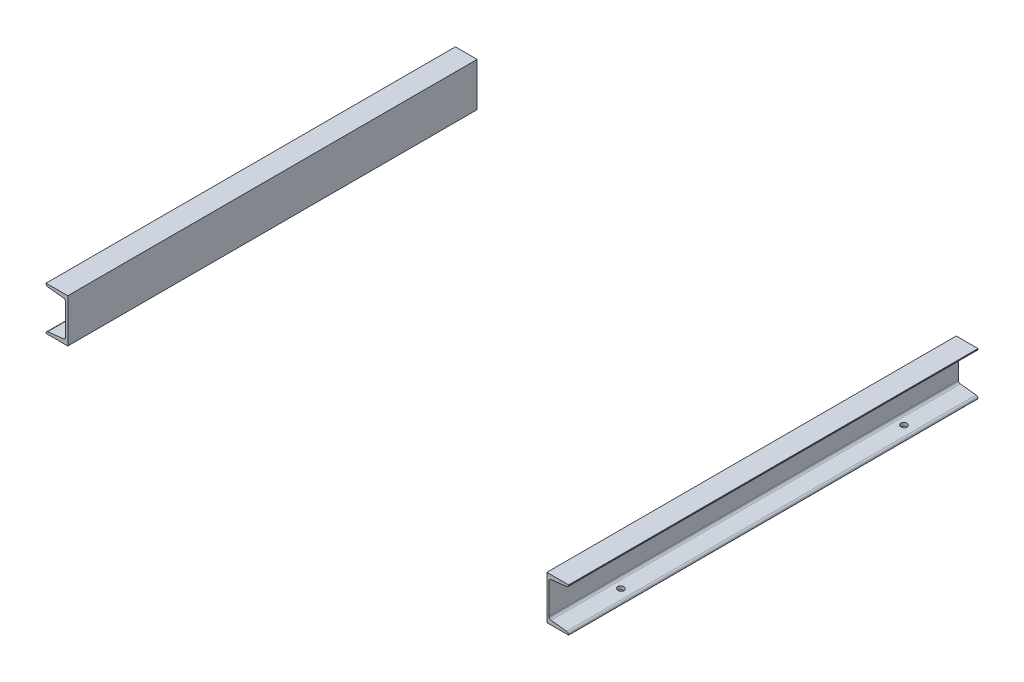
ISO-10303-21;
HEADER;
FILE_DESCRIPTION(('STEP AP214'),'2;1');
FILE_NAME('part.step','',(''),(''),'','','');
FILE_SCHEMA(('AUTOMOTIVE_DESIGN { 1 0 10303 214 1 1 1 1 }'));
ENDSEC;
DATA;
#1=APPLICATION_CONTEXT('core data for automotive mechanical design processes');
#2=APPLICATION_PROTOCOL_DEFINITION('international standard','automotive_design',2000,#1);
#3=PRODUCT_CONTEXT('',#1,'mechanical');
#4=PRODUCT('Part','Part','',(#3));
#5=PRODUCT_RELATED_PRODUCT_CATEGORY('part','',(#4));
#6=PRODUCT_DEFINITION_FORMATION('','',#4);
#7=PRODUCT_DEFINITION_CONTEXT('part definition',#1,'design');
#8=PRODUCT_DEFINITION('design','',#6,#7);
#9=PRODUCT_DEFINITION_SHAPE('','',#8);
#10=(LENGTH_UNIT() NAMED_UNIT(*) SI_UNIT(.MILLI.,.METRE.));
#11=(NAMED_UNIT(*) PLANE_ANGLE_UNIT() SI_UNIT($,.RADIAN.));
#12=(NAMED_UNIT(*) SI_UNIT($,.STERADIAN.) SOLID_ANGLE_UNIT());
#13=UNCERTAINTY_MEASURE_WITH_UNIT(LENGTH_MEASURE(1.E-05),#10,'distance_accuracy_value','');
#14=(GEOMETRIC_REPRESENTATION_CONTEXT(3) GLOBAL_UNCERTAINTY_ASSIGNED_CONTEXT((#13)) GLOBAL_UNIT_ASSIGNED_CONTEXT((#10,
#11,#12)) REPRESENTATION_CONTEXT('',''));
#15=CARTESIAN_POINT('',(0.,0.,0.));
#16=DIRECTION('',(0.,0.,1.));
#17=DIRECTION('',(1.,0.,0.));
#18=AXIS2_PLACEMENT_3D('',#15,#16,#17);
#19=CARTESIAN_POINT('',(600.,0.,470.000000000004));
#20=DIRECTION('',(-1.,0.,0.));
#21=DIRECTION('',(0.,0.,1.));
#22=AXIS2_PLACEMENT_3D('',#19,#20,#21);
#23=PLANE('',#22);
#24=DIRECTION('',(0.,1.,0.));
#25=VECTOR('',#24,1.);
#26=CARTESIAN_POINT('',(600.,0.,-469.999999999996));
#27=LINE('',#26,#25);
#28=CARTESIAN_POINT('',(600.,-0.52478603436791,-469.999999999996));
#29=VERTEX_POINT('',#28);
#30=CARTESIAN_POINT('',(600.,0.,-469.999999999996));
#31=VERTEX_POINT('',#30);
#32=EDGE_CURVE('E164',#29,#31,#27,.T.);
#33=ORIENTED_EDGE('',*,*,#32,.T.);
#34=DIRECTION('',(0.,0.,-1.));
#35=VECTOR('',#34,1.);
#36=CARTESIAN_POINT('',(600.,0.,470.000000000004));
#37=LINE('',#36,#35);
#38=CARTESIAN_POINT('',(600.,0.,470.000000000004));
#39=VERTEX_POINT('',#38);
#40=EDGE_CURVE('E12',#39,#31,#37,.T.);
#41=ORIENTED_EDGE('',*,*,#40,.F.);
#42=DIRECTION('',(0.,1.,0.));
#43=VECTOR('',#42,1.);
#44=CARTESIAN_POINT('',(600.,0.,470.000000000004));
#45=LINE('',#44,#43);
#46=CARTESIAN_POINT('',(600.,-0.52478603436791,470.000000000004));
#47=VERTEX_POINT('',#46);
#48=EDGE_CURVE('E186',#47,#39,#45,.T.);
#49=ORIENTED_EDGE('',*,*,#48,.F.);
#50=DIRECTION('',(0.,0.,-1.));
#51=VECTOR('',#50,1.);
#52=CARTESIAN_POINT('',(600.,-0.52478603436791,470.000000000004));
#53=LINE('',#52,#51);
#54=EDGE_CURVE('E160',#47,#29,#53,.T.);
#55=ORIENTED_EDGE('',*,*,#54,.T.);
#56=EDGE_LOOP('',(#33,#41,#49,#55));
#57=FACE_BOUND('',#56,.T.);
#58=ADVANCED_FACE('F42',(#57),#23,.F.);
#59=CARTESIAN_POINT('',(600.,0.,470.000000000004));
#60=DIRECTION('',(0.,-1.,0.));
#61=DIRECTION('',(0.,0.,-1.));
#62=AXIS2_PLACEMENT_3D('',#59,#60,#61);
#63=PLANE('',#62);
#64=DIRECTION('',(-1.,0.,0.));
#65=VECTOR('',#64,1.);
#66=CARTESIAN_POINT('',(600.,0.,-469.999999999996));
#67=LINE('',#66,#65);
#68=CARTESIAN_POINT('',(550.,0.,-469.999999999996));
#69=VERTEX_POINT('',#68);
#70=EDGE_CURVE('E167',#31,#69,#67,.T.);
#71=ORIENTED_EDGE('',*,*,#70,.T.);
#72=DIRECTION('',(0.,0.,-1.));
#73=VECTOR('',#72,1.);
#74=CARTESIAN_POINT('',(550.,0.,470.000000000004));
#75=LINE('',#74,#73);
#76=CARTESIAN_POINT('',(550.,0.,470.000000000004));
#77=VERTEX_POINT('',#76);
#78=EDGE_CURVE('E51',#77,#69,#75,.T.);
#79=ORIENTED_EDGE('',*,*,#78,.F.);
#80=DIRECTION('',(-1.,0.,0.));
#81=VECTOR('',#80,1.);
#82=CARTESIAN_POINT('',(600.,0.,470.000000000004));
#83=LINE('',#82,#81);
#84=EDGE_CURVE('E115',#39,#77,#83,.T.);
#85=ORIENTED_EDGE('',*,*,#84,.F.);
#86=ORIENTED_EDGE('',*,*,#40,.T.);
#87=EDGE_LOOP('',(#71,#79,#85,#86));
#88=FACE_BOUND('',#87,.T.);
#89=ADVANCED_FACE('F264',(#88),#63,.F.);
#90=CARTESIAN_POINT('',(550.,0.,470.000000000004));
#91=DIRECTION('',(1.,0.,0.));
#92=DIRECTION('',(0.,0.,-1.));
#93=AXIS2_PLACEMENT_3D('',#90,#91,#92);
#94=PLANE('',#93);
#95=DIRECTION('',(0.,-1.,0.));
#96=VECTOR('',#95,1.);
#97=CARTESIAN_POINT('',(550.,0.,-469.999999999996));
#98=LINE('',#97,#96);
#99=CARTESIAN_POINT('',(550.,-100.,-469.999999999996));
#100=VERTEX_POINT('',#99);
#101=EDGE_CURVE('E169',#69,#100,#98,.T.);
#102=ORIENTED_EDGE('',*,*,#101,.T.);
#103=DIRECTION('',(0.,0.,-1.));
#104=VECTOR('',#103,1.);
#105=CARTESIAN_POINT('',(550.,-100.,470.000000000004));
#106=LINE('',#105,#104);
#107=CARTESIAN_POINT('',(550.,-100.,470.000000000004));
#108=VERTEX_POINT('',#107);
#109=EDGE_CURVE('E205',#108,#100,#106,.T.);
#110=ORIENTED_EDGE('',*,*,#109,.F.);
#111=DIRECTION('',(0.,-1.,0.));
#112=VECTOR('',#111,1.);
#113=CARTESIAN_POINT('',(550.,0.,470.000000000004));
#114=LINE('',#113,#112);
#115=EDGE_CURVE('E225',#77,#108,#114,.T.);
#116=ORIENTED_EDGE('',*,*,#115,.F.);
#117=ORIENTED_EDGE('',*,*,#78,.T.);
#118=EDGE_LOOP('',(#102,#110,#116,#117));
#119=FACE_BOUND('',#118,.T.);
#120=ADVANCED_FACE('F268',(#119),#94,.F.);
#121=CARTESIAN_POINT('',(550.,-100.,470.000000000004));
#122=DIRECTION('',(0.,1.,0.));
#123=DIRECTION('',(0.,0.,1.));
#124=AXIS2_PLACEMENT_3D('',#121,#122,#123);
#125=PLANE('',#124);
#126=CARTESIAN_POINT('',(575.,-100.,-325.));
#127=DIRECTION('',(0.,-1.,0.));
#128=DIRECTION('',(0.,0.,-1.));
#129=AXIS2_PLACEMENT_3D('',#126,#127,#128);
#130=CIRCLE('',#129,7.00000000000004);
#131=CARTESIAN_POINT('',(575.,-100.,-332.));
#132=VERTEX_POINT('',#131);
#133=EDGE_CURVE('E211',#132,#132,#130,.T.);
#134=ORIENTED_EDGE('',*,*,#133,.F.);
#135=EDGE_LOOP('',(#134));
#136=FACE_BOUND('',#135,.T.);
#137=CARTESIAN_POINT('',(575.,-100.,325.));
#138=DIRECTION('',(0.,-1.,0.));
#139=DIRECTION('',(0.,0.,1.));
#140=AXIS2_PLACEMENT_3D('',#137,#138,#139);
#141=CIRCLE('',#140,7.00000000000004);
#142=CARTESIAN_POINT('',(575.,-100.,332.));
#143=VERTEX_POINT('',#142);
#144=EDGE_CURVE('E216',#143,#143,#141,.T.);
#145=ORIENTED_EDGE('',*,*,#144,.F.);
#146=EDGE_LOOP('',(#145));
#147=FACE_BOUND('',#146,.T.);
#148=DIRECTION('',(1.,0.,0.));
#149=VECTOR('',#148,1.);
#150=CARTESIAN_POINT('',(550.,-100.,-469.999999999996));
#151=LINE('',#150,#149);
#152=CARTESIAN_POINT('',(600.,-100.,-469.999999999996));
#153=VERTEX_POINT('',#152);
#154=EDGE_CURVE('E171',#100,#153,#151,.T.);
#155=ORIENTED_EDGE('',*,*,#154,.T.);
#156=DIRECTION('',(0.,0.,-1.));
#157=VECTOR('',#156,1.);
#158=CARTESIAN_POINT('',(600.,-100.,470.000000000004));
#159=LINE('',#158,#157);
#160=CARTESIAN_POINT('',(600.,-100.,470.000000000004));
#161=VERTEX_POINT('',#160);
#162=EDGE_CURVE('E202',#161,#153,#159,.T.);
#163=ORIENTED_EDGE('',*,*,#162,.F.);
#164=DIRECTION('',(1.,0.,0.));
#165=VECTOR('',#164,1.);
#166=CARTESIAN_POINT('',(550.,-100.,470.000000000004));
#167=LINE('',#166,#165);
#168=EDGE_CURVE('E227',#108,#161,#167,.T.);
#169=ORIENTED_EDGE('',*,*,#168,.F.);
#170=ORIENTED_EDGE('',*,*,#109,.T.);
#171=EDGE_LOOP('',(#155,#163,#169,#170));
#172=FACE_BOUND('',#171,.T.);
#173=ADVANCED_FACE('F272',(#136,#147,#172),#125,.F.);
#174=CARTESIAN_POINT('',(600.,-100.,470.000000000004));
#175=DIRECTION('',(-1.,0.,0.));
#176=DIRECTION('',(0.,0.,1.));
#177=AXIS2_PLACEMENT_3D('',#174,#175,#176);
#178=PLANE('',#177);
#179=DIRECTION('',(0.,1.,0.));
#180=VECTOR('',#179,1.);
#181=CARTESIAN_POINT('',(600.,-100.,-469.999999999996));
#182=LINE('',#181,#180);
#183=CARTESIAN_POINT('',(600.,-99.4752139656321,-469.999999999996));
#184=VERTEX_POINT('',#183);
#185=EDGE_CURVE('E173',#153,#184,#182,.T.);
#186=ORIENTED_EDGE('',*,*,#185,.T.);
#187=DIRECTION('',(0.,0.,-1.));
#188=VECTOR('',#187,1.);
#189=CARTESIAN_POINT('',(600.,-99.4752139656321,470.000000000004));
#190=LINE('',#189,#188);
#191=CARTESIAN_POINT('',(600.,-99.4752139656321,470.000000000004));
#192=VERTEX_POINT('',#191);
#193=EDGE_CURVE('E199',#192,#184,#190,.T.);
#194=ORIENTED_EDGE('',*,*,#193,.F.);
#195=DIRECTION('',(0.,1.,0.));
#196=VECTOR('',#195,1.);
#197=CARTESIAN_POINT('',(600.,-100.,470.000000000004));
#198=LINE('',#197,#196);
#199=EDGE_CURVE('E229',#161,#192,#198,.T.);
#200=ORIENTED_EDGE('',*,*,#199,.F.);
#201=ORIENTED_EDGE('',*,*,#162,.T.);
#202=EDGE_LOOP('',(#186,#194,#200,#201));
#203=FACE_BOUND('',#202,.T.);
#204=ADVANCED_FACE('F278',(#203),#178,.F.);
#205=CARTESIAN_POINT('',(595.,-99.4752139656321,470.000000000004));
#206=DIRECTION('',(0.,0.,-1.));
#207=DIRECTION('',(-1.,0.,0.));
#208=AXIS2_PLACEMENT_3D('',#205,#206,#207);
#209=CYLINDRICAL_SURFACE('',#208,4.99999999999984);
#210=CARTESIAN_POINT('',(595.,-99.4752139656321,-469.999999999996));
#211=DIRECTION('',(0.,0.,1.));
#212=DIRECTION('',(-1.,0.,0.));
#213=AXIS2_PLACEMENT_3D('',#210,#211,#212);
#214=CIRCLE('',#213,4.99999999999984);
#215=CARTESIAN_POINT('',(595.552157630374,-94.5057952922642,-469.999999999996));
#216=VERTEX_POINT('',#215);
#217=EDGE_CURVE('E175',#184,#216,#214,.T.);
#218=ORIENTED_EDGE('',*,*,#217,.T.);
#219=DIRECTION('',(0.,0.,-1.));
#220=VECTOR('',#219,1.);
#221=CARTESIAN_POINT('',(595.552157630374,-94.5057952922642,470.000000000004));
#222=LINE('',#221,#220);
#223=CARTESIAN_POINT('',(595.552157630374,-94.5057952922642,470.000000000004));
#224=VERTEX_POINT('',#223);
#225=EDGE_CURVE('E196',#224,#216,#222,.T.);
#226=ORIENTED_EDGE('',*,*,#225,.F.);
#227=CARTESIAN_POINT('',(595.,-99.4752139656321,470.000000000004));
#228=DIRECTION('',(0.,0.,1.));
#229=DIRECTION('',(-1.,0.,0.));
#230=AXIS2_PLACEMENT_3D('',#227,#228,#229);
#231=CIRCLE('',#230,4.99999999999984);
#232=EDGE_CURVE('E231',#192,#224,#231,.T.);
#233=ORIENTED_EDGE('',*,*,#232,.F.);
#234=ORIENTED_EDGE('',*,*,#193,.T.);
#235=EDGE_LOOP('',(#218,#226,#233,#234));
#236=FACE_BOUND('',#235,.T.);
#237=ADVANCED_FACE('F282',(#236),#209,.T.);
#238=CARTESIAN_POINT('',(559.447842369627,-90.4942047077362,470.000000000004));
#239=DIRECTION('',(-0.110431526074865,-0.993883734673617,0.));
#240=DIRECTION('',(0.993883734673617,-0.110431526074865,0.));
#241=AXIS2_PLACEMENT_3D('',#238,#239,#240);
#242=PLANE('',#241);
#243=CARTESIAN_POINT('',(575.,-92.2222222222223,-325.));
#244=DIRECTION('',(-0.110431526074865,-0.993883734673617,0.));
#245=DIRECTION('',(0.993883734673617,-0.110431526074865,0.));
#246=AXIS2_PLACEMENT_3D('',#243,#244,#245);
#247=ELLIPSE('',#246,7.04307732966249,7.00000000000004);
#248=CARTESIAN_POINT('',(582.,-93.0000000000003,-325.));
#249=VERTEX_POINT('',#248);
#250=EDGE_CURVE('E45',#249,#249,#247,.T.);
#251=ORIENTED_EDGE('',*,*,#250,.T.);
#252=EDGE_LOOP('',(#251));
#253=FACE_BOUND('',#252,.T.);
#254=CARTESIAN_POINT('',(575.,-92.2222222222223,325.));
#255=DIRECTION('',(-0.110431526074865,-0.993883734673617,0.));
#256=DIRECTION('',(0.993883734673617,-0.110431526074865,0.));
#257=AXIS2_PLACEMENT_3D('',#254,#255,#256);
#258=ELLIPSE('',#257,7.04307732966249,7.00000000000004);
#259=CARTESIAN_POINT('',(582.,-93.0000000000003,325.));
#260=VERTEX_POINT('',#259);
#261=EDGE_CURVE('E209',#260,#260,#258,.T.);
#262=ORIENTED_EDGE('',*,*,#261,.T.);
#263=EDGE_LOOP('',(#262));
#264=FACE_BOUND('',#263,.T.);
#265=DIRECTION('',(-0.993883734673617,0.110431526074865,0.));
#266=VECTOR('',#265,1.);
#267=CARTESIAN_POINT('',(559.447842369627,-90.4942047077362,-469.999999999996));
#268=LINE('',#267,#266);
#269=CARTESIAN_POINT('',(559.447842369627,-90.4942047077362,-469.999999999996));
#270=VERTEX_POINT('',#269);
#271=EDGE_CURVE('E177',#216,#270,#268,.T.);
#272=ORIENTED_EDGE('',*,*,#271,.T.);
#273=DIRECTION('',(0.,0.,-1.));
#274=VECTOR('',#273,1.);
#275=CARTESIAN_POINT('',(559.447842369627,-90.4942047077362,470.000000000004));
#276=LINE('',#275,#274);
#277=CARTESIAN_POINT('',(559.447842369627,-90.4942047077362,470.000000000004));
#278=VERTEX_POINT('',#277);
#279=EDGE_CURVE('E193',#278,#270,#276,.T.);
#280=ORIENTED_EDGE('',*,*,#279,.F.);
#281=DIRECTION('',(-0.993883734673617,0.110431526074865,0.));
#282=VECTOR('',#281,1.);
#283=CARTESIAN_POINT('',(559.447842369627,-90.4942047077362,470.000000000004));
#284=LINE('',#283,#282);
#285=EDGE_CURVE('E233',#224,#278,#284,.T.);
#286=ORIENTED_EDGE('',*,*,#285,.F.);
#287=ORIENTED_EDGE('',*,*,#225,.T.);
#288=EDGE_LOOP('',(#272,#280,#286,#287));
#289=FACE_BOUND('',#288,.T.);
#290=ADVANCED_FACE('F286',(#253,#264,#289),#242,.F.);
#291=CARTESIAN_POINT('',(560.,-85.5247860343679,470.000000000004));
#292=DIRECTION('',(0.,0.,-1.));
#293=DIRECTION('',(-1.,0.,0.));
#294=AXIS2_PLACEMENT_3D('',#291,#292,#293);
#295=CYLINDRICAL_SURFACE('',#294,5.);
#296=CARTESIAN_POINT('',(560.,-85.5247860343679,-469.999999999996));
#297=DIRECTION('',(0.,0.,-1.));
#298=DIRECTION('',(-1.,0.,0.));
#299=AXIS2_PLACEMENT_3D('',#296,#297,#298);
#300=CIRCLE('',#299,5.);
#301=CARTESIAN_POINT('',(555.,-85.5247860343679,-469.999999999996));
#302=VERTEX_POINT('',#301);
#303=EDGE_CURVE('E179',#270,#302,#300,.T.);
#304=ORIENTED_EDGE('',*,*,#303,.T.);
#305=DIRECTION('',(0.,0.,-1.));
#306=VECTOR('',#305,1.);
#307=CARTESIAN_POINT('',(555.,-85.5247860343679,470.000000000004));
#308=LINE('',#307,#306);
#309=CARTESIAN_POINT('',(555.,-85.5247860343679,470.000000000004));
#310=VERTEX_POINT('',#309);
#311=EDGE_CURVE('E190',#310,#302,#308,.T.);
#312=ORIENTED_EDGE('',*,*,#311,.F.);
#313=CARTESIAN_POINT('',(560.,-85.5247860343679,470.000000000004));
#314=DIRECTION('',(0.,0.,-1.));
#315=DIRECTION('',(-1.,0.,0.));
#316=AXIS2_PLACEMENT_3D('',#313,#314,#315);
#317=CIRCLE('',#316,5.);
#318=EDGE_CURVE('E235',#278,#310,#317,.T.);
#319=ORIENTED_EDGE('',*,*,#318,.F.);
#320=ORIENTED_EDGE('',*,*,#279,.T.);
#321=EDGE_LOOP('',(#304,#312,#319,#320));
#322=FACE_BOUND('',#321,.T.);
#323=ADVANCED_FACE('F241',(#322),#295,.F.);
#324=CARTESIAN_POINT('',(555.,-14.475213965632,470.000000000004));
#325=DIRECTION('',(-1.,0.,0.));
#326=DIRECTION('',(0.,0.,1.));
#327=AXIS2_PLACEMENT_3D('',#324,#325,#326);
#328=PLANE('',#327);
#329=DIRECTION('',(0.,1.,0.));
#330=VECTOR('',#329,1.);
#331=CARTESIAN_POINT('',(555.,-14.475213965632,-469.999999999996));
#332=LINE('',#331,#330);
#333=CARTESIAN_POINT('',(555.,-14.475213965632,-469.999999999996));
#334=VERTEX_POINT('',#333);
#335=EDGE_CURVE('E181',#302,#334,#332,.T.);
#336=ORIENTED_EDGE('',*,*,#335,.T.);
#337=DIRECTION('',(0.,0.,-1.));
#338=VECTOR('',#337,1.);
#339=CARTESIAN_POINT('',(555.,-14.475213965632,470.000000000004));
#340=LINE('',#339,#338);
#341=CARTESIAN_POINT('',(555.,-14.475213965632,470.000000000004));
#342=VERTEX_POINT('',#341);
#343=EDGE_CURVE('E155',#342,#334,#340,.T.);
#344=ORIENTED_EDGE('',*,*,#343,.F.);
#345=DIRECTION('',(0.,1.,0.));
#346=VECTOR('',#345,1.);
#347=CARTESIAN_POINT('',(555.,-14.475213965632,470.000000000004));
#348=LINE('',#347,#346);
#349=EDGE_CURVE('E146',#310,#342,#348,.T.);
#350=ORIENTED_EDGE('',*,*,#349,.F.);
#351=ORIENTED_EDGE('',*,*,#311,.T.);
#352=EDGE_LOOP('',(#336,#344,#350,#351));
#353=FACE_BOUND('',#352,.T.);
#354=ADVANCED_FACE('F245',(#353),#328,.F.);
#355=CARTESIAN_POINT('',(560.,-14.475213965632,470.000000000004));
#356=DIRECTION('',(0.,0.,-1.));
#357=DIRECTION('',(-1.,0.,0.));
#358=AXIS2_PLACEMENT_3D('',#355,#356,#357);
#359=CYLINDRICAL_SURFACE('',#358,4.99999999999983);
#360=CARTESIAN_POINT('',(560.,-14.475213965632,-469.999999999996));
#361=DIRECTION('',(0.,0.,-1.));
#362=DIRECTION('',(-1.,0.,0.));
#363=AXIS2_PLACEMENT_3D('',#360,#361,#362);
#364=CIRCLE('',#363,4.99999999999983);
#365=CARTESIAN_POINT('',(559.447842369626,-9.50579529226414,-469.999999999996));
#366=VERTEX_POINT('',#365);
#367=EDGE_CURVE('E154',#334,#366,#364,.T.);
#368=ORIENTED_EDGE('',*,*,#367,.T.);
#369=DIRECTION('',(0.,0.,-1.));
#370=VECTOR('',#369,1.);
#371=CARTESIAN_POINT('',(559.447842369626,-9.50579529226414,470.000000000004));
#372=LINE('',#371,#370);
#373=CARTESIAN_POINT('',(559.447842369626,-9.50579529226414,470.000000000004));
#374=VERTEX_POINT('',#373);
#375=EDGE_CURVE('E151',#374,#366,#372,.T.);
#376=ORIENTED_EDGE('',*,*,#375,.F.);
#377=CARTESIAN_POINT('',(560.,-14.475213965632,470.000000000004));
#378=DIRECTION('',(0.,0.,-1.));
#379=DIRECTION('',(-1.,0.,0.));
#380=AXIS2_PLACEMENT_3D('',#377,#378,#379);
#381=CIRCLE('',#380,4.99999999999983);
#382=EDGE_CURVE('E140',#342,#374,#381,.T.);
#383=ORIENTED_EDGE('',*,*,#382,.F.);
#384=ORIENTED_EDGE('',*,*,#343,.T.);
#385=EDGE_LOOP('',(#368,#376,#383,#384));
#386=FACE_BOUND('',#385,.T.);
#387=ADVANCED_FACE('F152',(#386),#359,.F.);
#388=CARTESIAN_POINT('',(595.552157630374,-5.49420470773655,470.000000000004));
#389=DIRECTION('',(-0.110431526074849,0.993883734673619,0.));
#390=DIRECTION('',(-0.993883734673619,-0.110431526074849,0.));
#391=AXIS2_PLACEMENT_3D('',#388,#389,#390);
#392=PLANE('',#391);
#393=DIRECTION('',(0.993883734673619,0.110431526074849,0.));
#394=VECTOR('',#393,1.);
#395=CARTESIAN_POINT('',(595.552157630374,-5.49420470773655,-469.999999999996));
#396=LINE('',#395,#394);
#397=CARTESIAN_POINT('',(595.552157630374,-5.49420470773655,-469.999999999996));
#398=VERTEX_POINT('',#397);
#399=EDGE_CURVE('E101',#366,#398,#396,.T.);
#400=ORIENTED_EDGE('',*,*,#399,.T.);
#401=DIRECTION('',(0.,0.,-1.));
#402=VECTOR('',#401,1.);
#403=CARTESIAN_POINT('',(595.552157630374,-5.49420470773655,470.000000000004));
#404=LINE('',#403,#402);
#405=CARTESIAN_POINT('',(595.552157630374,-5.49420470773655,470.000000000004));
#406=VERTEX_POINT('',#405);
#407=EDGE_CURVE('E156',#406,#398,#404,.T.);
#408=ORIENTED_EDGE('',*,*,#407,.F.);
#409=DIRECTION('',(0.993883734673619,0.110431526074849,0.));
#410=VECTOR('',#409,1.);
#411=CARTESIAN_POINT('',(595.552157630374,-5.49420470773655,470.000000000004));
#412=LINE('',#411,#410);
#413=EDGE_CURVE('E144',#374,#406,#412,.T.);
#414=ORIENTED_EDGE('',*,*,#413,.F.);
#415=ORIENTED_EDGE('',*,*,#375,.T.);
#416=EDGE_LOOP('',(#400,#408,#414,#415));
#417=FACE_BOUND('',#416,.T.);
#418=ADVANCED_FACE('F158',(#417),#392,.F.);
#419=CARTESIAN_POINT('',(595.,-0.524786034367911,470.000000000004));
#420=DIRECTION('',(0.,0.,-1.));
#421=DIRECTION('',(-1.,0.,0.));
#422=AXIS2_PLACEMENT_3D('',#419,#420,#421);
#423=CYLINDRICAL_SURFACE('',#422,5.00000000000029);
#424=CARTESIAN_POINT('',(595.,-0.524786034367911,-469.999999999996));
#425=DIRECTION('',(0.,0.,1.));
#426=DIRECTION('',(-1.,0.,0.));
#427=AXIS2_PLACEMENT_3D('',#424,#425,#426);
#428=CIRCLE('',#427,5.00000000000029);
#429=EDGE_CURVE('E107',#398,#29,#428,.T.);
#430=ORIENTED_EDGE('',*,*,#429,.T.);
#431=ORIENTED_EDGE('',*,*,#54,.F.);
#432=CARTESIAN_POINT('',(595.,-0.524786034367911,470.000000000004));
#433=DIRECTION('',(0.,0.,1.));
#434=DIRECTION('',(-1.,0.,0.));
#435=AXIS2_PLACEMENT_3D('',#432,#433,#434);
#436=CIRCLE('',#435,5.00000000000029);
#437=EDGE_CURVE('E60',#406,#47,#436,.T.);
#438=ORIENTED_EDGE('',*,*,#437,.F.);
#439=ORIENTED_EDGE('',*,*,#407,.T.);
#440=EDGE_LOOP('',(#430,#431,#438,#439));
#441=FACE_BOUND('',#440,.T.);
#442=ADVANCED_FACE('F253',(#441),#423,.T.);
#443=CARTESIAN_POINT('',(595.,-0.524786034367911,470.000000000004));
#444=DIRECTION('',(0.,0.,-1.));
#445=DIRECTION('',(-1.,0.,0.));
#446=AXIS2_PLACEMENT_3D('',#443,#444,#445);
#447=PLANE('',#446);
#448=ORIENTED_EDGE('',*,*,#48,.T.);
#449=ORIENTED_EDGE('',*,*,#84,.T.);
#450=ORIENTED_EDGE('',*,*,#115,.T.);
#451=ORIENTED_EDGE('',*,*,#168,.T.);
#452=ORIENTED_EDGE('',*,*,#199,.T.);
#453=ORIENTED_EDGE('',*,*,#232,.T.);
#454=ORIENTED_EDGE('',*,*,#285,.T.);
#455=ORIENTED_EDGE('',*,*,#318,.T.);
#456=ORIENTED_EDGE('',*,*,#349,.T.);
#457=ORIENTED_EDGE('',*,*,#382,.T.);
#458=ORIENTED_EDGE('',*,*,#413,.T.);
#459=ORIENTED_EDGE('',*,*,#437,.T.);
#460=EDGE_LOOP('',(#448,#449,#450,#451,#452,#453,#454,#455,#456,#457,#458,#459));
#461=FACE_BOUND('',#460,.T.);
#462=ADVANCED_FACE('F142',(#461),#447,.F.);
#463=CARTESIAN_POINT('',(595.,-0.524786034367911,-469.999999999996));
#464=DIRECTION('',(0.,0.,-1.));
#465=DIRECTION('',(-1.,0.,0.));
#466=AXIS2_PLACEMENT_3D('',#463,#464,#465);
#467=PLANE('',#466);
#468=ORIENTED_EDGE('',*,*,#32,.F.);
#469=ORIENTED_EDGE('',*,*,#429,.F.);
#470=ORIENTED_EDGE('',*,*,#399,.F.);
#471=ORIENTED_EDGE('',*,*,#367,.F.);
#472=ORIENTED_EDGE('',*,*,#335,.F.);
#473=ORIENTED_EDGE('',*,*,#303,.F.);
#474=ORIENTED_EDGE('',*,*,#271,.F.);
#475=ORIENTED_EDGE('',*,*,#217,.F.);
#476=ORIENTED_EDGE('',*,*,#185,.F.);
#477=ORIENTED_EDGE('',*,*,#154,.F.);
#478=ORIENTED_EDGE('',*,*,#101,.F.);
#479=ORIENTED_EDGE('',*,*,#70,.F.);
#480=EDGE_LOOP('',(#468,#469,#470,#471,#472,#473,#474,#475,#476,#477,#478,#479));
#481=FACE_BOUND('',#480,.T.);
#482=ADVANCED_FACE('F248',(#481),#467,.T.);
#483=CARTESIAN_POINT('',(575.,-90.,325.));
#484=DIRECTION('',(0.,-1.,0.));
#485=DIRECTION('',(0.,0.,-1.));
#486=AXIS2_PLACEMENT_3D('',#483,#484,#485);
#487=CYLINDRICAL_SURFACE('',#486,7.00000000000004);
#488=ORIENTED_EDGE('',*,*,#144,.T.);
#489=EDGE_LOOP('',(#488));
#490=FACE_BOUND('',#489,.T.);
#491=ORIENTED_EDGE('',*,*,#261,.F.);
#492=EDGE_LOOP('',(#491));
#493=FACE_BOUND('',#492,.T.);
#494=ADVANCED_FACE('F323',(#490,#493),#487,.F.);
#495=CARTESIAN_POINT('',(575.,-90.,-325.));
#496=DIRECTION('',(0.,-1.,0.));
#497=DIRECTION('',(0.,0.,-1.));
#498=AXIS2_PLACEMENT_3D('',#495,#496,#497);
#499=CYLINDRICAL_SURFACE('',#498,7.00000000000004);
#500=ORIENTED_EDGE('',*,*,#133,.T.);
#501=EDGE_LOOP('',(#500));
#502=FACE_BOUND('',#501,.T.);
#503=ORIENTED_EDGE('',*,*,#250,.F.);
#504=EDGE_LOOP('',(#503));
#505=FACE_BOUND('',#504,.T.);
#506=ADVANCED_FACE('F347',(#502,#505),#499,.F.);
#507=CLOSED_SHELL('',(#58,#89,#120,#173,#204,#237,#290,#323,#354,#387,#418,#442,#462,#482,#494,#506));
#508=MANIFOLD_SOLID_BREP('B2',#507);
#509=CARTESIAN_POINT('',(-600.,0.,470.));
#510=DIRECTION('',(1.,0.,0.));
#511=DIRECTION('',(0.,0.,-1.));
#512=AXIS2_PLACEMENT_3D('',#509,#510,#511);
#513=PLANE('',#512);
#514=DIRECTION('',(0.,-1.,0.));
#515=VECTOR('',#514,1.);
#516=CARTESIAN_POINT('',(-600.,0.,-470.));
#517=LINE('',#516,#515);
#518=CARTESIAN_POINT('',(-600.,0.,-470.));
#519=VERTEX_POINT('',#518);
#520=CARTESIAN_POINT('',(-600.,-0.52478603436791,-470.));
#521=VERTEX_POINT('',#520);
#522=EDGE_CURVE('E535',#519,#521,#517,.T.);
#523=ORIENTED_EDGE('',*,*,#522,.T.);
#524=DIRECTION('',(0.,0.,-1.));
#525=VECTOR('',#524,1.);
#526=CARTESIAN_POINT('',(-600.,-0.52478603436791,470.));
#527=LINE('',#526,#525);
#528=CARTESIAN_POINT('',(-600.,-0.52478603436791,470.));
#529=VERTEX_POINT('',#528);
#530=EDGE_CURVE('E40',#529,#521,#527,.T.);
#531=ORIENTED_EDGE('',*,*,#530,.F.);
#532=DIRECTION('',(0.,-1.,0.));
#533=VECTOR('',#532,1.);
#534=CARTESIAN_POINT('',(-600.,0.,470.));
#535=LINE('',#534,#533);
#536=CARTESIAN_POINT('',(-600.,0.,470.));
#537=VERTEX_POINT('',#536);
#538=EDGE_CURVE('E558',#537,#529,#535,.T.);
#539=ORIENTED_EDGE('',*,*,#538,.F.);
#540=DIRECTION('',(0.,0.,-1.));
#541=VECTOR('',#540,1.);
#542=CARTESIAN_POINT('',(-600.,0.,470.));
#543=LINE('',#542,#541);
#544=EDGE_CURVE('E531',#537,#519,#543,.T.);
#545=ORIENTED_EDGE('',*,*,#544,.T.);
#546=EDGE_LOOP('',(#523,#531,#539,#545));
#547=FACE_BOUND('',#546,.T.);
#548=ADVANCED_FACE('F415',(#547),#513,.F.);
#549=CARTESIAN_POINT('',(-595.,-0.524786034367911,470.));
#550=DIRECTION('',(0.,0.,-1.));
#551=DIRECTION('',(-1.,0.,0.));
#552=AXIS2_PLACEMENT_3D('',#549,#550,#551);
#553=CYLINDRICAL_SURFACE('',#552,5.00000000000029);
#554=CARTESIAN_POINT('',(-595.,-0.524786034367911,-470.));
#555=DIRECTION('',(0.,0.,1.));
#556=DIRECTION('',(1.,0.,0.));
#557=AXIS2_PLACEMENT_3D('',#554,#555,#556);
#558=CIRCLE('',#557,5.00000000000029);
#559=CARTESIAN_POINT('',(-595.552157630374,-5.49420470773655,-470.));
#560=VERTEX_POINT('',#559);
#561=EDGE_CURVE('E538',#521,#560,#558,.T.);
#562=ORIENTED_EDGE('',*,*,#561,.T.);
#563=DIRECTION('',(0.,0.,-1.));
#564=VECTOR('',#563,1.);
#565=CARTESIAN_POINT('',(-595.552157630374,-5.49420470773655,470.));
#566=LINE('',#565,#564);
#567=CARTESIAN_POINT('',(-595.552157630374,-5.49420470773655,470.));
#568=VERTEX_POINT('',#567);
#569=EDGE_CURVE('E423',#568,#560,#566,.T.);
#570=ORIENTED_EDGE('',*,*,#569,.F.);
#571=CARTESIAN_POINT('',(-595.,-0.524786034367911,470.));
#572=DIRECTION('',(0.,0.,1.));
#573=DIRECTION('',(1.,0.,0.));
#574=AXIS2_PLACEMENT_3D('',#571,#572,#573);
#575=CIRCLE('',#574,5.00000000000029);
#576=EDGE_CURVE('E486',#529,#568,#575,.T.);
#577=ORIENTED_EDGE('',*,*,#576,.F.);
#578=ORIENTED_EDGE('',*,*,#530,.T.);
#579=EDGE_LOOP('',(#562,#570,#577,#578));
#580=FACE_BOUND('',#579,.T.);
#581=ADVANCED_FACE('F636',(#580),#553,.T.);
#582=CARTESIAN_POINT('',(-595.552157630374,-5.49420470773655,470.));
#583=DIRECTION('',(0.110431526074849,0.993883734673619,0.));
#584=DIRECTION('',(-0.993883734673619,0.110431526074849,0.));
#585=AXIS2_PLACEMENT_3D('',#582,#583,#584);
#586=PLANE('',#585);
#587=DIRECTION('',(0.993883734673619,-0.110431526074849,0.));
#588=VECTOR('',#587,1.);
#589=CARTESIAN_POINT('',(-595.552157630374,-5.49420470773655,-470.));
#590=LINE('',#589,#588);
#591=CARTESIAN_POINT('',(-559.447842369626,-9.50579529226414,-470.));
#592=VERTEX_POINT('',#591);
#593=EDGE_CURVE('E541',#560,#592,#590,.T.);
#594=ORIENTED_EDGE('',*,*,#593,.T.);
#595=DIRECTION('',(0.,0.,-1.));
#596=VECTOR('',#595,1.);
#597=CARTESIAN_POINT('',(-559.447842369626,-9.50579529226414,470.));
#598=LINE('',#597,#596);
#599=CARTESIAN_POINT('',(-559.447842369626,-9.50579529226414,470.));
#600=VERTEX_POINT('',#599);
#601=EDGE_CURVE('E577',#600,#592,#598,.T.);
#602=ORIENTED_EDGE('',*,*,#601,.F.);
#603=DIRECTION('',(0.993883734673619,-0.110431526074849,0.));
#604=VECTOR('',#603,1.);
#605=CARTESIAN_POINT('',(-595.552157630374,-5.49420470773655,470.));
#606=LINE('',#605,#604);
#607=EDGE_CURVE('E585',#568,#600,#606,.T.);
#608=ORIENTED_EDGE('',*,*,#607,.F.);
#609=ORIENTED_EDGE('',*,*,#569,.T.);
#610=EDGE_LOOP('',(#594,#602,#608,#609));
#611=FACE_BOUND('',#610,.T.);
#612=ADVANCED_FACE('F583',(#611),#586,.F.);
#613=CARTESIAN_POINT('',(-560.,-14.475213965632,470.));
#614=DIRECTION('',(0.,0.,-1.));
#615=DIRECTION('',(-1.,0.,0.));
#616=AXIS2_PLACEMENT_3D('',#613,#614,#615);
#617=CYLINDRICAL_SURFACE('',#616,4.99999999999983);
#618=CARTESIAN_POINT('',(-560.,-14.475213965632,-470.));
#619=DIRECTION('',(0.,0.,-1.));
#620=DIRECTION('',(1.,0.,0.));
#621=AXIS2_PLACEMENT_3D('',#618,#619,#620);
#622=CIRCLE('',#621,4.99999999999983);
#623=CARTESIAN_POINT('',(-555.,-14.475213965632,-470.));
#624=VERTEX_POINT('',#623);
#625=EDGE_CURVE('E543',#592,#624,#622,.T.);
#626=ORIENTED_EDGE('',*,*,#625,.T.);
#627=DIRECTION('',(0.,0.,-1.));
#628=VECTOR('',#627,1.);
#629=CARTESIAN_POINT('',(-555.,-14.475213965632,470.));
#630=LINE('',#629,#628);
#631=CARTESIAN_POINT('',(-555.,-14.475213965632,470.));
#632=VERTEX_POINT('',#631);
#633=EDGE_CURVE('E574',#632,#624,#630,.T.);
#634=ORIENTED_EDGE('',*,*,#633,.F.);
#635=CARTESIAN_POINT('',(-560.,-14.475213965632,470.));
#636=DIRECTION('',(0.,0.,-1.));
#637=DIRECTION('',(1.,0.,0.));
#638=AXIS2_PLACEMENT_3D('',#635,#636,#637);
#639=CIRCLE('',#638,4.99999999999983);
#640=EDGE_CURVE('E603',#600,#632,#639,.T.);
#641=ORIENTED_EDGE('',*,*,#640,.F.);
#642=ORIENTED_EDGE('',*,*,#601,.T.);
#643=EDGE_LOOP('',(#626,#634,#641,#642));
#644=FACE_BOUND('',#643,.T.);
#645=ADVANCED_FACE('F594',(#644),#617,.F.);
#646=CARTESIAN_POINT('',(-555.,-14.475213965632,470.));
#647=DIRECTION('',(1.,0.,0.));
#648=DIRECTION('',(0.,0.,-1.));
#649=AXIS2_PLACEMENT_3D('',#646,#647,#648);
#650=PLANE('',#649);
#651=DIRECTION('',(0.,-1.,0.));
#652=VECTOR('',#651,1.);
#653=CARTESIAN_POINT('',(-555.,-14.475213965632,-470.));
#654=LINE('',#653,#652);
#655=CARTESIAN_POINT('',(-555.,-85.5247860343679,-470.));
#656=VERTEX_POINT('',#655);
#657=EDGE_CURVE('E545',#624,#656,#654,.T.);
#658=ORIENTED_EDGE('',*,*,#657,.T.);
#659=DIRECTION('',(0.,0.,-1.));
#660=VECTOR('',#659,1.);
#661=CARTESIAN_POINT('',(-555.,-85.5247860343679,470.));
#662=LINE('',#661,#660);
#663=CARTESIAN_POINT('',(-555.,-85.5247860343679,470.));
#664=VERTEX_POINT('',#663);
#665=EDGE_CURVE('E571',#664,#656,#662,.T.);
#666=ORIENTED_EDGE('',*,*,#665,.F.);
#667=DIRECTION('',(0.,-1.,0.));
#668=VECTOR('',#667,1.);
#669=CARTESIAN_POINT('',(-555.,-14.475213965632,470.));
#670=LINE('',#669,#668);
#671=EDGE_CURVE('E600',#632,#664,#670,.T.);
#672=ORIENTED_EDGE('',*,*,#671,.F.);
#673=ORIENTED_EDGE('',*,*,#633,.T.);
#674=EDGE_LOOP('',(#658,#666,#672,#673));
#675=FACE_BOUND('',#674,.T.);
#676=ADVANCED_FACE('F598',(#675),#650,.F.);
#677=CARTESIAN_POINT('',(-560.,-85.5247860343679,470.));
#678=DIRECTION('',(0.,0.,-1.));
#679=DIRECTION('',(-1.,0.,0.));
#680=AXIS2_PLACEMENT_3D('',#677,#678,#679);
#681=CYLINDRICAL_SURFACE('',#680,5.);
#682=CARTESIAN_POINT('',(-560.,-85.5247860343679,-470.));
#683=DIRECTION('',(0.,0.,-1.));
#684=DIRECTION('',(1.,0.,0.));
#685=AXIS2_PLACEMENT_3D('',#682,#683,#684);
#686=CIRCLE('',#685,5.);
#687=CARTESIAN_POINT('',(-559.447842369627,-90.4942047077362,-470.));
#688=VERTEX_POINT('',#687);
#689=EDGE_CURVE('E547',#656,#688,#686,.T.);
#690=ORIENTED_EDGE('',*,*,#689,.T.);
#691=DIRECTION('',(0.,0.,-1.));
#692=VECTOR('',#691,1.);
#693=CARTESIAN_POINT('',(-559.447842369627,-90.4942047077362,470.));
#694=LINE('',#693,#692);
#695=CARTESIAN_POINT('',(-559.447842369627,-90.4942047077362,470.));
#696=VERTEX_POINT('',#695);
#697=EDGE_CURVE('E568',#696,#688,#694,.T.);
#698=ORIENTED_EDGE('',*,*,#697,.F.);
#699=CARTESIAN_POINT('',(-560.,-85.5247860343679,470.));
#700=DIRECTION('',(0.,0.,-1.));
#701=DIRECTION('',(1.,0.,0.));
#702=AXIS2_PLACEMENT_3D('',#699,#700,#701);
#703=CIRCLE('',#702,5.);
#704=EDGE_CURVE('E602',#664,#696,#703,.T.);
#705=ORIENTED_EDGE('',*,*,#704,.F.);
#706=ORIENTED_EDGE('',*,*,#665,.T.);
#707=EDGE_LOOP('',(#690,#698,#705,#706));
#708=FACE_BOUND('',#707,.T.);
#709=ADVANCED_FACE('F649',(#708),#681,.F.);
#710=CARTESIAN_POINT('',(-559.447842369627,-90.4942047077362,470.));
#711=DIRECTION('',(0.110431526074865,-0.993883734673617,0.));
#712=DIRECTION('',(0.993883734673617,0.110431526074865,0.));
#713=AXIS2_PLACEMENT_3D('',#710,#711,#712);
#714=PLANE('',#713);
#715=CARTESIAN_POINT('',(-575.,-92.2222222222223,325.));
#716=DIRECTION('',(0.110431526074865,-0.993883734673617,0.));
#717=DIRECTION('',(-0.993883734673617,-0.110431526074865,0.));
#718=AXIS2_PLACEMENT_3D('',#715,#716,#717);
#719=ELLIPSE('',#718,7.04307732966249,7.00000000000004);
#720=CARTESIAN_POINT('',(-582.,-93.0000000000003,325.));
#721=VERTEX_POINT('',#720);
#722=EDGE_CURVE('E539',#721,#721,#719,.T.);
#723=ORIENTED_EDGE('',*,*,#722,.T.);
#724=EDGE_LOOP('',(#723));
#725=FACE_BOUND('',#724,.T.);
#726=CARTESIAN_POINT('',(-575.,-92.2222222222223,-325.));
#727=DIRECTION('',(0.110431526074865,-0.993883734673617,0.));
#728=DIRECTION('',(-0.993883734673617,-0.110431526074865,0.));
#729=AXIS2_PLACEMENT_3D('',#726,#727,#728);
#730=ELLIPSE('',#729,7.04307732966249,7.00000000000004);
#731=CARTESIAN_POINT('',(-582.,-93.0000000000003,-325.));
#732=VERTEX_POINT('',#731);
#733=EDGE_CURVE('E674',#732,#732,#730,.T.);
#734=ORIENTED_EDGE('',*,*,#733,.T.);
#735=EDGE_LOOP('',(#734));
#736=FACE_BOUND('',#735,.T.);
#737=DIRECTION('',(-0.993883734673617,-0.110431526074865,0.));
#738=VECTOR('',#737,1.);
#739=CARTESIAN_POINT('',(-559.447842369627,-90.4942047077362,-470.));
#740=LINE('',#739,#738);
#741=CARTESIAN_POINT('',(-595.552157630374,-94.5057952922642,-470.));
#742=VERTEX_POINT('',#741);
#743=EDGE_CURVE('E549',#688,#742,#740,.T.);
#744=ORIENTED_EDGE('',*,*,#743,.T.);
#745=DIRECTION('',(0.,0.,-1.));
#746=VECTOR('',#745,1.);
#747=CARTESIAN_POINT('',(-595.552157630374,-94.5057952922642,470.));
#748=LINE('',#747,#746);
#749=CARTESIAN_POINT('',(-595.552157630374,-94.5057952922642,470.));
#750=VERTEX_POINT('',#749);
#751=EDGE_CURVE('E565',#750,#742,#748,.T.);
#752=ORIENTED_EDGE('',*,*,#751,.F.);
#753=DIRECTION('',(-0.993883734673617,-0.110431526074865,0.));
#754=VECTOR('',#753,1.);
#755=CARTESIAN_POINT('',(-559.447842369627,-90.4942047077362,470.));
#756=LINE('',#755,#754);
#757=EDGE_CURVE('E605',#696,#750,#756,.T.);
#758=ORIENTED_EDGE('',*,*,#757,.F.);
#759=ORIENTED_EDGE('',*,*,#697,.T.);
#760=EDGE_LOOP('',(#744,#752,#758,#759));
#761=FACE_BOUND('',#760,.T.);
#762=ADVANCED_FACE('F652',(#725,#736,#761),#714,.F.);
#763=CARTESIAN_POINT('',(-595.,-99.4752139656321,470.));
#764=DIRECTION('',(0.,0.,-1.));
#765=DIRECTION('',(-1.,0.,0.));
#766=AXIS2_PLACEMENT_3D('',#763,#764,#765);
#767=CYLINDRICAL_SURFACE('',#766,4.99999999999984);
#768=CARTESIAN_POINT('',(-595.,-99.4752139656321,-470.));
#769=DIRECTION('',(0.,0.,1.));
#770=DIRECTION('',(1.,0.,0.));
#771=AXIS2_PLACEMENT_3D('',#768,#769,#770);
#772=CIRCLE('',#771,4.99999999999984);
#773=CARTESIAN_POINT('',(-600.,-99.4752139656321,-470.));
#774=VERTEX_POINT('',#773);
#775=EDGE_CURVE('E551',#742,#774,#772,.T.);
#776=ORIENTED_EDGE('',*,*,#775,.T.);
#777=DIRECTION('',(0.,0.,-1.));
#778=VECTOR('',#777,1.);
#779=CARTESIAN_POINT('',(-600.,-99.4752139656321,470.));
#780=LINE('',#779,#778);
#781=CARTESIAN_POINT('',(-600.,-99.4752139656321,470.));
#782=VERTEX_POINT('',#781);
#783=EDGE_CURVE('E562',#782,#774,#780,.T.);
#784=ORIENTED_EDGE('',*,*,#783,.F.);
#785=CARTESIAN_POINT('',(-595.,-99.4752139656321,470.));
#786=DIRECTION('',(0.,0.,1.));
#787=DIRECTION('',(1.,0.,0.));
#788=AXIS2_PLACEMENT_3D('',#785,#786,#787);
#789=CIRCLE('',#788,4.99999999999984);
#790=EDGE_CURVE('E611',#750,#782,#789,.T.);
#791=ORIENTED_EDGE('',*,*,#790,.F.);
#792=ORIENTED_EDGE('',*,*,#751,.T.);
#793=EDGE_LOOP('',(#776,#784,#791,#792));
#794=FACE_BOUND('',#793,.T.);
#795=ADVANCED_FACE('F617',(#794),#767,.T.);
#796=CARTESIAN_POINT('',(-600.,-100.,470.));
#797=DIRECTION('',(1.,0.,0.));
#798=DIRECTION('',(0.,0.,-1.));
#799=AXIS2_PLACEMENT_3D('',#796,#797,#798);
#800=PLANE('',#799);
#801=DIRECTION('',(0.,-1.,0.));
#802=VECTOR('',#801,1.);
#803=CARTESIAN_POINT('',(-600.,-100.,-470.));
#804=LINE('',#803,#802);
#805=CARTESIAN_POINT('',(-600.,-100.,-470.));
#806=VERTEX_POINT('',#805);
#807=EDGE_CURVE('E553',#774,#806,#804,.T.);
#808=ORIENTED_EDGE('',*,*,#807,.T.);
#809=DIRECTION('',(0.,0.,-1.));
#810=VECTOR('',#809,1.);
#811=CARTESIAN_POINT('',(-600.,-100.,470.));
#812=LINE('',#811,#810);
#813=CARTESIAN_POINT('',(-600.,-100.,470.));
#814=VERTEX_POINT('',#813);
#815=EDGE_CURVE('E526',#814,#806,#812,.T.);
#816=ORIENTED_EDGE('',*,*,#815,.F.);
#817=DIRECTION('',(0.,-1.,0.));
#818=VECTOR('',#817,1.);
#819=CARTESIAN_POINT('',(-600.,-100.,470.));
#820=LINE('',#819,#818);
#821=EDGE_CURVE('E517',#782,#814,#820,.T.);
#822=ORIENTED_EDGE('',*,*,#821,.F.);
#823=ORIENTED_EDGE('',*,*,#783,.T.);
#824=EDGE_LOOP('',(#808,#816,#822,#823));
#825=FACE_BOUND('',#824,.T.);
#826=ADVANCED_FACE('F621',(#825),#800,.F.);
#827=CARTESIAN_POINT('',(-550.,-100.,470.));
#828=DIRECTION('',(0.,1.,0.));
#829=DIRECTION('',(0.,0.,1.));
#830=AXIS2_PLACEMENT_3D('',#827,#828,#829);
#831=PLANE('',#830);
#832=CARTESIAN_POINT('',(-575.,-100.,325.));
#833=DIRECTION('',(0.,-1.,0.));
#834=DIRECTION('',(0.,0.,-1.));
#835=AXIS2_PLACEMENT_3D('',#832,#833,#834);
#836=CIRCLE('',#835,7.00000000000004);
#837=CARTESIAN_POINT('',(-575.,-100.,318.));
#838=VERTEX_POINT('',#837);
#839=EDGE_CURVE('E668',#838,#838,#836,.T.);
#840=ORIENTED_EDGE('',*,*,#839,.F.);
#841=EDGE_LOOP('',(#840));
#842=FACE_BOUND('',#841,.T.);
#843=CARTESIAN_POINT('',(-575.,-100.,-325.));
#844=DIRECTION('',(0.,-1.,0.));
#845=DIRECTION('',(0.,0.,1.));
#846=AXIS2_PLACEMENT_3D('',#843,#844,#845);
#847=CIRCLE('',#846,7.00000000000004);
#848=CARTESIAN_POINT('',(-575.,-100.,-318.));
#849=VERTEX_POINT('',#848);
#850=EDGE_CURVE('E671',#849,#849,#847,.T.);
#851=ORIENTED_EDGE('',*,*,#850,.F.);
#852=EDGE_LOOP('',(#851));
#853=FACE_BOUND('',#852,.T.);
#854=DIRECTION('',(1.,0.,0.));
#855=VECTOR('',#854,1.);
#856=CARTESIAN_POINT('',(-550.,-100.,-470.));
#857=LINE('',#856,#855);
#858=CARTESIAN_POINT('',(-550.,-100.,-470.));
#859=VERTEX_POINT('',#858);
#860=EDGE_CURVE('E525',#806,#859,#857,.T.);
#861=ORIENTED_EDGE('',*,*,#860,.T.);
#862=DIRECTION('',(0.,0.,-1.));
#863=VECTOR('',#862,1.);
#864=CARTESIAN_POINT('',(-550.,-100.,470.));
#865=LINE('',#864,#863);
#866=CARTESIAN_POINT('',(-550.,-100.,470.));
#867=VERTEX_POINT('',#866);
#868=EDGE_CURVE('E522',#867,#859,#865,.T.);
#869=ORIENTED_EDGE('',*,*,#868,.F.);
#870=DIRECTION('',(1.,0.,0.));
#871=VECTOR('',#870,1.);
#872=CARTESIAN_POINT('',(-550.,-100.,470.));
#873=LINE('',#872,#871);
#874=EDGE_CURVE('E511',#814,#867,#873,.T.);
#875=ORIENTED_EDGE('',*,*,#874,.F.);
#876=ORIENTED_EDGE('',*,*,#815,.T.);
#877=EDGE_LOOP('',(#861,#869,#875,#876));
#878=FACE_BOUND('',#877,.T.);
#879=ADVANCED_FACE('F523',(#842,#853,#878),#831,.F.);
#880=CARTESIAN_POINT('',(-550.,0.,470.));
#881=DIRECTION('',(-1.,0.,0.));
#882=DIRECTION('',(0.,0.,1.));
#883=AXIS2_PLACEMENT_3D('',#880,#881,#882);
#884=PLANE('',#883);
#885=DIRECTION('',(0.,1.,0.));
#886=VECTOR('',#885,1.);
#887=CARTESIAN_POINT('',(-550.,0.,-470.));
#888=LINE('',#887,#886);
#889=CARTESIAN_POINT('',(-550.,0.,-470.));
#890=VERTEX_POINT('',#889);
#891=EDGE_CURVE('E472',#859,#890,#888,.T.);
#892=ORIENTED_EDGE('',*,*,#891,.T.);
#893=DIRECTION('',(0.,0.,-1.));
#894=VECTOR('',#893,1.);
#895=CARTESIAN_POINT('',(-550.,0.,470.));
#896=LINE('',#895,#894);
#897=CARTESIAN_POINT('',(-550.,0.,470.));
#898=VERTEX_POINT('',#897);
#899=EDGE_CURVE('E527',#898,#890,#896,.T.);
#900=ORIENTED_EDGE('',*,*,#899,.F.);
#901=DIRECTION('',(0.,1.,0.));
#902=VECTOR('',#901,1.);
#903=CARTESIAN_POINT('',(-550.,0.,470.));
#904=LINE('',#903,#902);
#905=EDGE_CURVE('E515',#867,#898,#904,.T.);
#906=ORIENTED_EDGE('',*,*,#905,.F.);
#907=ORIENTED_EDGE('',*,*,#868,.T.);
#908=EDGE_LOOP('',(#892,#900,#906,#907));
#909=FACE_BOUND('',#908,.T.);
#910=ADVANCED_FACE('F529',(#909),#884,.F.);
#911=CARTESIAN_POINT('',(-600.,0.,470.));
#912=DIRECTION('',(0.,-1.,0.));
#913=DIRECTION('',(0.,0.,-1.));
#914=AXIS2_PLACEMENT_3D('',#911,#912,#913);
#915=PLANE('',#914);
#916=DIRECTION('',(-1.,0.,0.));
#917=VECTOR('',#916,1.);
#918=CARTESIAN_POINT('',(-600.,0.,-470.));
#919=LINE('',#918,#917);
#920=EDGE_CURVE('E478',#890,#519,#919,.T.);
#921=ORIENTED_EDGE('',*,*,#920,.T.);
#922=ORIENTED_EDGE('',*,*,#544,.F.);
#923=DIRECTION('',(-1.,0.,0.));
#924=VECTOR('',#923,1.);
#925=CARTESIAN_POINT('',(-600.,0.,470.));
#926=LINE('',#925,#924);
#927=EDGE_CURVE('E431',#898,#537,#926,.T.);
#928=ORIENTED_EDGE('',*,*,#927,.F.);
#929=ORIENTED_EDGE('',*,*,#899,.T.);
#930=EDGE_LOOP('',(#921,#922,#928,#929));
#931=FACE_BOUND('',#930,.T.);
#932=ADVANCED_FACE('F625',(#931),#915,.F.);
#933=CARTESIAN_POINT('',(-595.,-0.524786034367911,470.));
#934=DIRECTION('',(0.,0.,1.));
#935=DIRECTION('',(1.,0.,0.));
#936=AXIS2_PLACEMENT_3D('',#933,#934,#935);
#937=PLANE('',#936);
#938=ORIENTED_EDGE('',*,*,#538,.T.);
#939=ORIENTED_EDGE('',*,*,#576,.T.);
#940=ORIENTED_EDGE('',*,*,#607,.T.);
#941=ORIENTED_EDGE('',*,*,#640,.T.);
#942=ORIENTED_EDGE('',*,*,#671,.T.);
#943=ORIENTED_EDGE('',*,*,#704,.T.);
#944=ORIENTED_EDGE('',*,*,#757,.T.);
#945=ORIENTED_EDGE('',*,*,#790,.T.);
#946=ORIENTED_EDGE('',*,*,#821,.T.);
#947=ORIENTED_EDGE('',*,*,#874,.T.);
#948=ORIENTED_EDGE('',*,*,#905,.T.);
#949=ORIENTED_EDGE('',*,*,#927,.T.);
#950=EDGE_LOOP('',(#938,#939,#940,#941,#942,#943,#944,#945,#946,#947,#948,#949));
#951=FACE_BOUND('',#950,.T.);
#952=ADVANCED_FACE('F513',(#951),#937,.T.);
#953=CARTESIAN_POINT('',(-595.,-0.524786034367911,-470.));
#954=DIRECTION('',(0.,0.,1.));
#955=DIRECTION('',(1.,0.,0.));
#956=AXIS2_PLACEMENT_3D('',#953,#954,#955);
#957=PLANE('',#956);
#958=ORIENTED_EDGE('',*,*,#522,.F.);
#959=ORIENTED_EDGE('',*,*,#920,.F.);
#960=ORIENTED_EDGE('',*,*,#891,.F.);
#961=ORIENTED_EDGE('',*,*,#860,.F.);
#962=ORIENTED_EDGE('',*,*,#807,.F.);
#963=ORIENTED_EDGE('',*,*,#775,.F.);
#964=ORIENTED_EDGE('',*,*,#743,.F.);
#965=ORIENTED_EDGE('',*,*,#689,.F.);
#966=ORIENTED_EDGE('',*,*,#657,.F.);
#967=ORIENTED_EDGE('',*,*,#625,.F.);
#968=ORIENTED_EDGE('',*,*,#593,.F.);
#969=ORIENTED_EDGE('',*,*,#561,.F.);
#970=EDGE_LOOP('',(#958,#959,#960,#961,#962,#963,#964,#965,#966,#967,#968,#969));
#971=FACE_BOUND('',#970,.T.);
#972=ADVANCED_FACE('F589',(#971),#957,.F.);
#973=CARTESIAN_POINT('',(-575.,-90.,-325.));
#974=DIRECTION('',(0.,-1.,0.));
#975=DIRECTION('',(0.,0.,-1.));
#976=AXIS2_PLACEMENT_3D('',#973,#974,#975);
#977=CYLINDRICAL_SURFACE('',#976,7.00000000000004);
#978=ORIENTED_EDGE('',*,*,#850,.T.);
#979=EDGE_LOOP('',(#978));
#980=FACE_BOUND('',#979,.T.);
#981=ORIENTED_EDGE('',*,*,#733,.F.);
#982=EDGE_LOOP('',(#981));
#983=FACE_BOUND('',#982,.T.);
#984=ADVANCED_FACE('F687',(#980,#983),#977,.F.);
#985=CARTESIAN_POINT('',(-575.,-90.,325.));
#986=DIRECTION('',(0.,-1.,0.));
#987=DIRECTION('',(0.,0.,-1.));
#988=AXIS2_PLACEMENT_3D('',#985,#986,#987);
#989=CYLINDRICAL_SURFACE('',#988,7.00000000000004);
#990=ORIENTED_EDGE('',*,*,#839,.T.);
#991=EDGE_LOOP('',(#990));
#992=FACE_BOUND('',#991,.T.);
#993=ORIENTED_EDGE('',*,*,#722,.F.);
#994=EDGE_LOOP('',(#993));
#995=FACE_BOUND('',#994,.T.);
#996=ADVANCED_FACE('F685',(#992,#995),#989,.F.);
#997=CLOSED_SHELL('',(#548,#581,#612,#645,#676,#709,#762,#795,#826,#879,#910,#932,#952,#972,
#984,#996));
#998=MANIFOLD_SOLID_BREP('B6',#997);
#999=ADVANCED_BREP_SHAPE_REPRESENTATION('',(#18,#508,#998),#14);
#1000=SHAPE_DEFINITION_REPRESENTATION(#9,#999);
ENDSEC;
END-ISO-10303-21;
